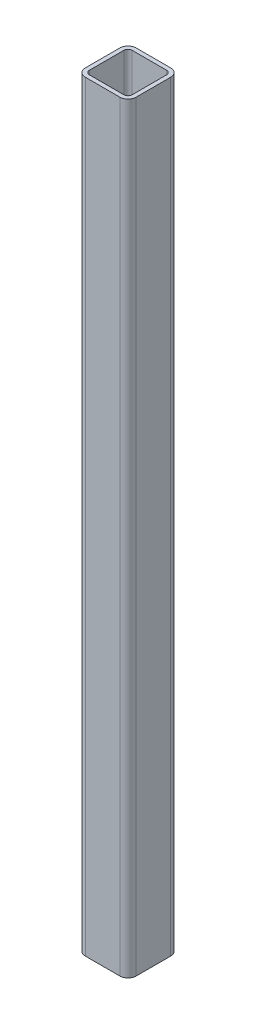
ISO-10303-21;
HEADER;
FILE_DESCRIPTION(('STEP AP214'),'2;1');
FILE_NAME('part.step','',(''),(''),'','','');
FILE_SCHEMA(('AUTOMOTIVE_DESIGN { 1 0 10303 214 1 1 1 1 }'));
ENDSEC;
DATA;
#1=APPLICATION_CONTEXT('core data for automotive mechanical design processes');
#2=APPLICATION_PROTOCOL_DEFINITION('international standard','automotive_design',2000,#1);
#3=PRODUCT_CONTEXT('',#1,'mechanical');
#4=PRODUCT('Part','Part','',(#3));
#5=PRODUCT_RELATED_PRODUCT_CATEGORY('part','',(#4));
#6=PRODUCT_DEFINITION_FORMATION('','',#4);
#7=PRODUCT_DEFINITION_CONTEXT('part definition',#1,'design');
#8=PRODUCT_DEFINITION('design','',#6,#7);
#9=PRODUCT_DEFINITION_SHAPE('','',#8);
#10=(LENGTH_UNIT() NAMED_UNIT(*) SI_UNIT(.MILLI.,.METRE.));
#11=(NAMED_UNIT(*) PLANE_ANGLE_UNIT() SI_UNIT($,.RADIAN.));
#12=(NAMED_UNIT(*) SI_UNIT($,.STERADIAN.) SOLID_ANGLE_UNIT());
#13=UNCERTAINTY_MEASURE_WITH_UNIT(LENGTH_MEASURE(1.E-05),#10,'distance_accuracy_value','');
#14=(GEOMETRIC_REPRESENTATION_CONTEXT(3) GLOBAL_UNCERTAINTY_ASSIGNED_CONTEXT((#13)) GLOBAL_UNIT_ASSIGNED_CONTEXT((#10,
#11,#12)) REPRESENTATION_CONTEXT('',''));
#15=CARTESIAN_POINT('',(0.,0.,0.));
#16=DIRECTION('',(0.,0.,1.));
#17=DIRECTION('',(1.,0.,0.));
#18=AXIS2_PLACEMENT_3D('',#15,#16,#17);
#19=CARTESIAN_POINT('',(1193.6,910.,293.6));
#20=DIRECTION('',(0.,1.,0.));
#21=DIRECTION('',(0.,0.,1.));
#22=AXIS2_PLACEMENT_3D('',#19,#20,#21);
#23=CYLINDRICAL_SURFACE('',#22,6.39999999999996);
#24=CARTESIAN_POINT('',(1193.6,930.,293.6));
#25=DIRECTION('',(0.,1.,0.));
#26=DIRECTION('',(0.,0.,1.));
#27=AXIS2_PLACEMENT_3D('',#24,#25,#26);
#28=CIRCLE('',#27,6.39999999999996);
#29=CARTESIAN_POINT('',(1200.,930.,293.6));
#30=VERTEX_POINT('',#29);
#31=CARTESIAN_POINT('',(1193.6,930.,300.));
#32=VERTEX_POINT('',#31);
#33=EDGE_CURVE('E151',#30,#32,#28,.F.);
#34=ORIENTED_EDGE('',*,*,#33,.F.);
#35=DIRECTION('',(0.,1.,0.));
#36=VECTOR('',#35,1.);
#37=CARTESIAN_POINT('',(1200.,910.,293.6));
#38=LINE('',#37,#36);
#39=CARTESIAN_POINT('',(1200.,1530.,293.6));
#40=VERTEX_POINT('',#39);
#41=EDGE_CURVE('E139',#30,#40,#38,.T.);
#42=ORIENTED_EDGE('',*,*,#41,.T.);
#43=CARTESIAN_POINT('',(1193.6,1530.,293.6));
#44=DIRECTION('',(0.,1.,0.));
#45=DIRECTION('',(0.,0.,1.));
#46=AXIS2_PLACEMENT_3D('',#43,#44,#45);
#47=CIRCLE('',#46,6.39999999999996);
#48=CARTESIAN_POINT('',(1193.6,1530.,300.));
#49=VERTEX_POINT('',#48);
#50=EDGE_CURVE('E190',#49,#40,#47,.T.);
#51=ORIENTED_EDGE('',*,*,#50,.F.);
#52=DIRECTION('',(0.,1.,0.));
#53=VECTOR('',#52,1.);
#54=CARTESIAN_POINT('',(1193.6,910.,300.));
#55=LINE('',#54,#53);
#56=EDGE_CURVE('E157',#49,#32,#55,.F.);
#57=ORIENTED_EDGE('',*,*,#56,.T.);
#58=EDGE_LOOP('',(#34,#42,#51,#57));
#59=FACE_BOUND('',#58,.T.);
#60=ADVANCED_FACE('F19',(#59),#23,.T.);
#61=CARTESIAN_POINT('',(1200.,910.,293.599999999999));
#62=DIRECTION('',(-1.,0.,0.));
#63=DIRECTION('',(0.,0.,1.));
#64=AXIS2_PLACEMENT_3D('',#61,#62,#63);
#65=PLANE('',#64);
#66=DIRECTION('',(0.,0.,1.));
#67=VECTOR('',#66,1.);
#68=CARTESIAN_POINT('',(1200.,1530.,-880.000000000001));
#69=LINE('',#68,#67);
#70=CARTESIAN_POINT('',(1200.,1530.,266.4));
#71=VERTEX_POINT('',#70);
#72=EDGE_CURVE('E192',#40,#71,#69,.F.);
#73=ORIENTED_EDGE('',*,*,#72,.F.);
#74=ORIENTED_EDGE('',*,*,#41,.F.);
#75=DIRECTION('',(0.,0.,-1.));
#76=VECTOR('',#75,1.);
#77=CARTESIAN_POINT('',(1200.,930.,-880.));
#78=LINE('',#77,#76);
#79=CARTESIAN_POINT('',(1200.,930.,266.4));
#80=VERTEX_POINT('',#79);
#81=EDGE_CURVE('E145',#80,#30,#78,.F.);
#82=ORIENTED_EDGE('',*,*,#81,.F.);
#83=DIRECTION('',(0.,1.,0.));
#84=VECTOR('',#83,1.);
#85=CARTESIAN_POINT('',(1200.,910.,266.4));
#86=LINE('',#85,#84);
#87=EDGE_CURVE('E132',#71,#80,#86,.F.);
#88=ORIENTED_EDGE('',*,*,#87,.F.);
#89=EDGE_LOOP('',(#73,#74,#82,#88));
#90=FACE_BOUND('',#89,.T.);
#91=ADVANCED_FACE('F149',(#90),#65,.F.);
#92=CARTESIAN_POINT('',(1193.6,910.,266.399999999999));
#93=DIRECTION('',(0.,1.,0.));
#94=DIRECTION('',(0.,0.,1.));
#95=AXIS2_PLACEMENT_3D('',#92,#93,#94);
#96=CYLINDRICAL_SURFACE('',#95,6.39999999999996);
#97=CARTESIAN_POINT('',(1193.6,930.,266.399999999999));
#98=DIRECTION('',(0.,1.,0.));
#99=DIRECTION('',(0.,0.,1.));
#100=AXIS2_PLACEMENT_3D('',#97,#98,#99);
#101=CIRCLE('',#100,6.39999999999996);
#102=CARTESIAN_POINT('',(1193.6,930.,260.));
#103=VERTEX_POINT('',#102);
#104=EDGE_CURVE('E22',#103,#80,#101,.F.);
#105=ORIENTED_EDGE('',*,*,#104,.F.);
#106=DIRECTION('',(0.,-1.,0.));
#107=VECTOR('',#106,1.);
#108=CARTESIAN_POINT('',(1193.6,910.,259.999999999999));
#109=LINE('',#108,#107);
#110=CARTESIAN_POINT('',(1193.6,1530.,260.));
#111=VERTEX_POINT('',#110);
#112=EDGE_CURVE('E125',#103,#111,#109,.F.);
#113=ORIENTED_EDGE('',*,*,#112,.T.);
#114=CARTESIAN_POINT('',(1193.6,1530.,266.4));
#115=DIRECTION('',(0.,1.,0.));
#116=DIRECTION('',(0.,0.,1.));
#117=AXIS2_PLACEMENT_3D('',#114,#115,#116);
#118=CIRCLE('',#117,6.39999999999996);
#119=EDGE_CURVE('E135',#71,#111,#118,.T.);
#120=ORIENTED_EDGE('',*,*,#119,.F.);
#121=ORIENTED_EDGE('',*,*,#87,.T.);
#122=EDGE_LOOP('',(#105,#113,#120,#121));
#123=FACE_BOUND('',#122,.T.);
#124=ADVANCED_FACE('F134',(#123),#96,.T.);
#125=CARTESIAN_POINT('',(1166.4,910.,259.999999999999));
#126=DIRECTION('',(0.,0.,1.));
#127=DIRECTION('',(0.,-1.,0.));
#128=AXIS2_PLACEMENT_3D('',#125,#126,#127);
#129=PLANE('',#128);
#130=DIRECTION('',(1.,0.,0.));
#131=VECTOR('',#130,1.);
#132=CARTESIAN_POINT('',(1193.6,1530.,260.));
#133=LINE('',#132,#131);
#134=CARTESIAN_POINT('',(1166.4,1530.,260.));
#135=VERTEX_POINT('',#134);
#136=EDGE_CURVE('E224',#111,#135,#133,.F.);
#137=ORIENTED_EDGE('',*,*,#136,.F.);
#138=ORIENTED_EDGE('',*,*,#112,.F.);
#139=DIRECTION('',(1.,0.,0.));
#140=VECTOR('',#139,1.);
#141=CARTESIAN_POINT('',(1166.4,930.,260.));
#142=LINE('',#141,#140);
#143=CARTESIAN_POINT('',(1166.4,930.,260.));
#144=VERTEX_POINT('',#143);
#145=EDGE_CURVE('E148',#144,#103,#142,.T.);
#146=ORIENTED_EDGE('',*,*,#145,.F.);
#147=DIRECTION('',(0.,1.,0.));
#148=VECTOR('',#147,1.);
#149=CARTESIAN_POINT('',(1166.4,910.,259.999999999999));
#150=LINE('',#149,#148);
#151=EDGE_CURVE('E227',#135,#144,#150,.F.);
#152=ORIENTED_EDGE('',*,*,#151,.F.);
#153=EDGE_LOOP('',(#137,#138,#146,#152));
#154=FACE_BOUND('',#153,.T.);
#155=ADVANCED_FACE('F265',(#154),#129,.F.);
#156=CARTESIAN_POINT('',(1193.6,910.,296.8));
#157=DIRECTION('',(0.,0.,-1.));
#158=DIRECTION('',(0.,1.,0.));
#159=AXIS2_PLACEMENT_3D('',#156,#157,#158);
#160=PLANE('',#159);
#161=DIRECTION('',(0.,1.,0.));
#162=VECTOR('',#161,1.);
#163=CARTESIAN_POINT('',(1193.6,910.,296.799999999999));
#164=LINE('',#163,#162);
#165=CARTESIAN_POINT('',(1193.6,1530.,296.799999999999));
#166=VERTEX_POINT('',#165);
#167=CARTESIAN_POINT('',(1193.6,930.,296.799999999999));
#168=VERTEX_POINT('',#167);
#169=EDGE_CURVE('E166',#166,#168,#164,.F.);
#170=ORIENTED_EDGE('',*,*,#169,.T.);
#171=DIRECTION('',(1.,0.,0.));
#172=VECTOR('',#171,1.);
#173=CARTESIAN_POINT('',(1166.4,930.,296.799999999999));
#174=LINE('',#173,#172);
#175=CARTESIAN_POINT('',(1166.4,930.,296.799999999999));
#176=VERTEX_POINT('',#175);
#177=EDGE_CURVE('E237',#176,#168,#174,.T.);
#178=ORIENTED_EDGE('',*,*,#177,.F.);
#179=DIRECTION('',(0.,1.,0.));
#180=VECTOR('',#179,1.);
#181=CARTESIAN_POINT('',(1166.4,910.,296.799999999999));
#182=LINE('',#181,#180);
#183=CARTESIAN_POINT('',(1166.4,1530.,296.799999999999));
#184=VERTEX_POINT('',#183);
#185=EDGE_CURVE('E264',#176,#184,#182,.T.);
#186=ORIENTED_EDGE('',*,*,#185,.T.);
#187=DIRECTION('',(1.,0.,0.));
#188=VECTOR('',#187,1.);
#189=CARTESIAN_POINT('',(1193.6,1530.,296.799999999999));
#190=LINE('',#189,#188);
#191=EDGE_CURVE('E221',#166,#184,#190,.F.);
#192=ORIENTED_EDGE('',*,*,#191,.F.);
#193=EDGE_LOOP('',(#170,#178,#186,#192));
#194=FACE_BOUND('',#193,.T.);
#195=ADVANCED_FACE('F286',(#194),#160,.T.);
#196=CARTESIAN_POINT('',(1166.4,910.,293.599999999999));
#197=DIRECTION('',(0.,1.,0.));
#198=DIRECTION('',(0.,0.,1.));
#199=AXIS2_PLACEMENT_3D('',#196,#197,#198);
#200=CYLINDRICAL_SURFACE('',#199,3.19999999999998);
#201=DIRECTION('',(0.,1.,0.));
#202=VECTOR('',#201,1.);
#203=CARTESIAN_POINT('',(1163.2,910.,293.6));
#204=LINE('',#203,#202);
#205=CARTESIAN_POINT('',(1163.2,1530.,293.6));
#206=VERTEX_POINT('',#205);
#207=CARTESIAN_POINT('',(1163.2,930.,293.6));
#208=VERTEX_POINT('',#207);
#209=EDGE_CURVE('E294',#206,#208,#204,.F.);
#210=ORIENTED_EDGE('',*,*,#209,.F.);
#211=CARTESIAN_POINT('',(1166.4,1530.,293.6));
#212=DIRECTION('',(0.,1.,0.));
#213=DIRECTION('',(0.,0.,1.));
#214=AXIS2_PLACEMENT_3D('',#211,#212,#213);
#215=CIRCLE('',#214,3.19999999999998);
#216=EDGE_CURVE('E219',#184,#206,#215,.F.);
#217=ORIENTED_EDGE('',*,*,#216,.F.);
#218=ORIENTED_EDGE('',*,*,#185,.F.);
#219=CARTESIAN_POINT('',(1166.4,930.,293.599999999999));
#220=DIRECTION('',(0.,1.,0.));
#221=DIRECTION('',(0.,0.,1.));
#222=AXIS2_PLACEMENT_3D('',#219,#220,#221);
#223=CIRCLE('',#222,3.19999999999998);
#224=EDGE_CURVE('E238',#208,#176,#223,.T.);
#225=ORIENTED_EDGE('',*,*,#224,.F.);
#226=EDGE_LOOP('',(#210,#217,#218,#225));
#227=FACE_BOUND('',#226,.T.);
#228=ADVANCED_FACE('F295',(#227),#200,.F.);
#229=CARTESIAN_POINT('',(1163.2,910.,266.399999999999));
#230=DIRECTION('',(1.,0.,0.));
#231=DIRECTION('',(0.,0.,-1.));
#232=AXIS2_PLACEMENT_3D('',#229,#230,#231);
#233=PLANE('',#232);
#234=ORIENTED_EDGE('',*,*,#209,.T.);
#235=DIRECTION('',(0.,0.,-1.));
#236=VECTOR('',#235,1.);
#237=CARTESIAN_POINT('',(1163.2,930.,-880.));
#238=LINE('',#237,#236);
#239=CARTESIAN_POINT('',(1163.2,930.,266.4));
#240=VERTEX_POINT('',#239);
#241=EDGE_CURVE('E241',#240,#208,#238,.F.);
#242=ORIENTED_EDGE('',*,*,#241,.F.);
#243=DIRECTION('',(0.,1.,0.));
#244=VECTOR('',#243,1.);
#245=CARTESIAN_POINT('',(1163.2,910.,266.4));
#246=LINE('',#245,#244);
#247=CARTESIAN_POINT('',(1163.2,1530.,266.4));
#248=VERTEX_POINT('',#247);
#249=EDGE_CURVE('E177',#240,#248,#246,.T.);
#250=ORIENTED_EDGE('',*,*,#249,.T.);
#251=DIRECTION('',(0.,0.,1.));
#252=VECTOR('',#251,1.);
#253=CARTESIAN_POINT('',(1163.2,1530.,-880.000000000001));
#254=LINE('',#253,#252);
#255=EDGE_CURVE('E218',#206,#248,#254,.F.);
#256=ORIENTED_EDGE('',*,*,#255,.F.);
#257=EDGE_LOOP('',(#234,#242,#250,#256));
#258=FACE_BOUND('',#257,.T.);
#259=ADVANCED_FACE('F297',(#258),#233,.T.);
#260=CARTESIAN_POINT('',(1166.4,910.,266.399999999999));
#261=DIRECTION('',(0.,1.,0.));
#262=DIRECTION('',(0.,0.,1.));
#263=AXIS2_PLACEMENT_3D('',#260,#261,#262);
#264=CYLINDRICAL_SURFACE('',#263,3.19999999999993);
#265=DIRECTION('',(0.,-1.,0.));
#266=VECTOR('',#265,1.);
#267=CARTESIAN_POINT('',(1166.4,910.,263.199999999999));
#268=LINE('',#267,#266);
#269=CARTESIAN_POINT('',(1166.4,1530.,263.2));
#270=VERTEX_POINT('',#269);
#271=CARTESIAN_POINT('',(1166.4,930.,263.2));
#272=VERTEX_POINT('',#271);
#273=EDGE_CURVE('E174',#270,#272,#268,.T.);
#274=ORIENTED_EDGE('',*,*,#273,.F.);
#275=CARTESIAN_POINT('',(1166.4,1530.,266.4));
#276=DIRECTION('',(0.,1.,0.));
#277=DIRECTION('',(0.,0.,1.));
#278=AXIS2_PLACEMENT_3D('',#275,#276,#277);
#279=CIRCLE('',#278,3.19999999999993);
#280=EDGE_CURVE('E216',#248,#270,#279,.F.);
#281=ORIENTED_EDGE('',*,*,#280,.F.);
#282=ORIENTED_EDGE('',*,*,#249,.F.);
#283=CARTESIAN_POINT('',(1166.4,930.,266.399999999999));
#284=DIRECTION('',(0.,1.,0.));
#285=DIRECTION('',(0.,0.,1.));
#286=AXIS2_PLACEMENT_3D('',#283,#284,#285);
#287=CIRCLE('',#286,3.19999999999993);
#288=EDGE_CURVE('E242',#272,#240,#287,.T.);
#289=ORIENTED_EDGE('',*,*,#288,.F.);
#290=EDGE_LOOP('',(#274,#281,#282,#289));
#291=FACE_BOUND('',#290,.T.);
#292=ADVANCED_FACE('F301',(#291),#264,.F.);
#293=CARTESIAN_POINT('',(1166.4,910.,263.199999999999));
#294=DIRECTION('',(0.,0.,1.));
#295=DIRECTION('',(0.,-1.,0.));
#296=AXIS2_PLACEMENT_3D('',#293,#294,#295);
#297=PLANE('',#296);
#298=ORIENTED_EDGE('',*,*,#273,.T.);
#299=DIRECTION('',(1.,0.,0.));
#300=VECTOR('',#299,1.);
#301=CARTESIAN_POINT('',(1166.4,930.,263.2));
#302=LINE('',#301,#300);
#303=CARTESIAN_POINT('',(1193.6,930.,263.2));
#304=VERTEX_POINT('',#303);
#305=EDGE_CURVE('E232',#304,#272,#302,.F.);
#306=ORIENTED_EDGE('',*,*,#305,.F.);
#307=DIRECTION('',(0.,1.,0.));
#308=VECTOR('',#307,1.);
#309=CARTESIAN_POINT('',(1193.6,910.,263.2));
#310=LINE('',#309,#308);
#311=CARTESIAN_POINT('',(1193.6,1530.,263.2));
#312=VERTEX_POINT('',#311);
#313=EDGE_CURVE('E171',#304,#312,#310,.T.);
#314=ORIENTED_EDGE('',*,*,#313,.T.);
#315=DIRECTION('',(1.,0.,0.));
#316=VECTOR('',#315,1.);
#317=CARTESIAN_POINT('',(1193.6,1530.,263.2));
#318=LINE('',#317,#316);
#319=EDGE_CURVE('E215',#270,#312,#318,.T.);
#320=ORIENTED_EDGE('',*,*,#319,.F.);
#321=EDGE_LOOP('',(#298,#306,#314,#320));
#322=FACE_BOUND('',#321,.T.);
#323=ADVANCED_FACE('F305',(#322),#297,.T.);
#324=CARTESIAN_POINT('',(1193.6,910.,266.399999999999));
#325=DIRECTION('',(0.,1.,0.));
#326=DIRECTION('',(0.,0.,1.));
#327=AXIS2_PLACEMENT_3D('',#324,#325,#326);
#328=CYLINDRICAL_SURFACE('',#327,3.19999999999993);
#329=DIRECTION('',(0.,1.,0.));
#330=VECTOR('',#329,1.);
#331=CARTESIAN_POINT('',(1196.8,910.,266.4));
#332=LINE('',#331,#330);
#333=CARTESIAN_POINT('',(1196.8,1530.,266.4));
#334=VERTEX_POINT('',#333);
#335=CARTESIAN_POINT('',(1196.8,930.,266.4));
#336=VERTEX_POINT('',#335);
#337=EDGE_CURVE('E167',#334,#336,#332,.F.);
#338=ORIENTED_EDGE('',*,*,#337,.F.);
#339=CARTESIAN_POINT('',(1193.6,1530.,266.4));
#340=DIRECTION('',(0.,1.,0.));
#341=DIRECTION('',(0.,0.,1.));
#342=AXIS2_PLACEMENT_3D('',#339,#340,#341);
#343=CIRCLE('',#342,3.19999999999993);
#344=EDGE_CURVE('E213',#312,#334,#343,.F.);
#345=ORIENTED_EDGE('',*,*,#344,.F.);
#346=ORIENTED_EDGE('',*,*,#313,.F.);
#347=CARTESIAN_POINT('',(1193.6,930.,266.399999999999));
#348=DIRECTION('',(0.,1.,0.));
#349=DIRECTION('',(0.,0.,1.));
#350=AXIS2_PLACEMENT_3D('',#347,#348,#349);
#351=CIRCLE('',#350,3.19999999999993);
#352=EDGE_CURVE('E228',#336,#304,#351,.T.);
#353=ORIENTED_EDGE('',*,*,#352,.F.);
#354=EDGE_LOOP('',(#338,#345,#346,#353));
#355=FACE_BOUND('',#354,.T.);
#356=ADVANCED_FACE('F308',(#355),#328,.F.);
#357=CARTESIAN_POINT('',(1196.8,910.,293.6));
#358=DIRECTION('',(-1.,0.,0.));
#359=DIRECTION('',(0.,0.,1.));
#360=AXIS2_PLACEMENT_3D('',#357,#358,#359);
#361=PLANE('',#360);
#362=ORIENTED_EDGE('',*,*,#337,.T.);
#363=DIRECTION('',(0.,0.,-1.));
#364=VECTOR('',#363,1.);
#365=CARTESIAN_POINT('',(1196.8,930.,-880.));
#366=LINE('',#365,#364);
#367=CARTESIAN_POINT('',(1196.8,930.,293.6));
#368=VERTEX_POINT('',#367);
#369=EDGE_CURVE('E233',#368,#336,#366,.T.);
#370=ORIENTED_EDGE('',*,*,#369,.F.);
#371=DIRECTION('',(0.,1.,0.));
#372=VECTOR('',#371,1.);
#373=CARTESIAN_POINT('',(1196.8,910.,293.6));
#374=LINE('',#373,#372);
#375=CARTESIAN_POINT('',(1196.8,1530.,293.6));
#376=VERTEX_POINT('',#375);
#377=EDGE_CURVE('E163',#368,#376,#374,.T.);
#378=ORIENTED_EDGE('',*,*,#377,.T.);
#379=DIRECTION('',(0.,0.,1.));
#380=VECTOR('',#379,1.);
#381=CARTESIAN_POINT('',(1196.8,1530.,-880.000000000001));
#382=LINE('',#381,#380);
#383=EDGE_CURVE('E212',#334,#376,#382,.T.);
#384=ORIENTED_EDGE('',*,*,#383,.F.);
#385=EDGE_LOOP('',(#362,#370,#378,#384));
#386=FACE_BOUND('',#385,.T.);
#387=ADVANCED_FACE('F279',(#386),#361,.T.);
#388=CARTESIAN_POINT('',(1193.6,910.,293.6));
#389=DIRECTION('',(0.,1.,0.));
#390=DIRECTION('',(0.,0.,1.));
#391=AXIS2_PLACEMENT_3D('',#388,#389,#390);
#392=CYLINDRICAL_SURFACE('',#391,3.19999999999993);
#393=ORIENTED_EDGE('',*,*,#169,.F.);
#394=CARTESIAN_POINT('',(1193.6,1530.,293.6));
#395=DIRECTION('',(0.,1.,0.));
#396=DIRECTION('',(0.,0.,1.));
#397=AXIS2_PLACEMENT_3D('',#394,#395,#396);
#398=CIRCLE('',#397,3.19999999999993);
#399=EDGE_CURVE('E209',#376,#166,#398,.F.);
#400=ORIENTED_EDGE('',*,*,#399,.F.);
#401=ORIENTED_EDGE('',*,*,#377,.F.);
#402=CARTESIAN_POINT('',(1193.6,930.,293.6));
#403=DIRECTION('',(0.,1.,0.));
#404=DIRECTION('',(0.,0.,1.));
#405=AXIS2_PLACEMENT_3D('',#402,#403,#404);
#406=CIRCLE('',#405,3.19999999999993);
#407=EDGE_CURVE('E234',#168,#368,#406,.T.);
#408=ORIENTED_EDGE('',*,*,#407,.F.);
#409=EDGE_LOOP('',(#393,#400,#401,#408));
#410=FACE_BOUND('',#409,.T.);
#411=ADVANCED_FACE('F283',(#410),#392,.F.);
#412=CARTESIAN_POINT('',(1193.6,910.,300.));
#413=DIRECTION('',(0.,0.,-1.));
#414=DIRECTION('',(0.,1.,0.));
#415=AXIS2_PLACEMENT_3D('',#412,#413,#414);
#416=PLANE('',#415);
#417=DIRECTION('',(1.,0.,0.));
#418=VECTOR('',#417,1.);
#419=CARTESIAN_POINT('',(1193.6,1530.,300.));
#420=LINE('',#419,#418);
#421=CARTESIAN_POINT('',(1166.4,1530.,300.));
#422=VERTEX_POINT('',#421);
#423=EDGE_CURVE('E185',#422,#49,#420,.T.);
#424=ORIENTED_EDGE('',*,*,#423,.F.);
#425=DIRECTION('',(0.,1.,0.));
#426=VECTOR('',#425,1.);
#427=CARTESIAN_POINT('',(1166.4,910.,299.999999999999));
#428=LINE('',#427,#426);
#429=CARTESIAN_POINT('',(1166.4,930.,300.));
#430=VERTEX_POINT('',#429);
#431=EDGE_CURVE('E158',#430,#422,#428,.T.);
#432=ORIENTED_EDGE('',*,*,#431,.F.);
#433=DIRECTION('',(1.,0.,0.));
#434=VECTOR('',#433,1.);
#435=CARTESIAN_POINT('',(1166.4,930.,300.));
#436=LINE('',#435,#434);
#437=EDGE_CURVE('E153',#32,#430,#436,.F.);
#438=ORIENTED_EDGE('',*,*,#437,.F.);
#439=ORIENTED_EDGE('',*,*,#56,.F.);
#440=EDGE_LOOP('',(#424,#432,#438,#439));
#441=FACE_BOUND('',#440,.T.);
#442=ADVANCED_FACE('F257',(#441),#416,.F.);
#443=CARTESIAN_POINT('',(1166.4,930.,-880.));
#444=DIRECTION('',(0.,-1.,0.));
#445=DIRECTION('',(0.,0.,-1.));
#446=AXIS2_PLACEMENT_3D('',#443,#444,#445);
#447=PLANE('',#446);
#448=ORIENTED_EDGE('',*,*,#352,.T.);
#449=ORIENTED_EDGE('',*,*,#305,.T.);
#450=ORIENTED_EDGE('',*,*,#288,.T.);
#451=ORIENTED_EDGE('',*,*,#241,.T.);
#452=ORIENTED_EDGE('',*,*,#224,.T.);
#453=ORIENTED_EDGE('',*,*,#177,.T.);
#454=ORIENTED_EDGE('',*,*,#407,.T.);
#455=ORIENTED_EDGE('',*,*,#369,.T.);
#456=EDGE_LOOP('',(#448,#449,#450,#451,#452,#453,#454,#455));
#457=FACE_BOUND('',#456,.T.);
#458=CARTESIAN_POINT('',(1166.4,930.,293.599999999999));
#459=DIRECTION('',(0.,1.,0.));
#460=DIRECTION('',(0.,0.,1.));
#461=AXIS2_PLACEMENT_3D('',#458,#459,#460);
#462=CIRCLE('',#461,6.40000000000002);
#463=CARTESIAN_POINT('',(1160.,930.,293.6));
#464=VERTEX_POINT('',#463);
#465=EDGE_CURVE('E162',#464,#430,#462,.T.);
#466=ORIENTED_EDGE('',*,*,#465,.F.);
#467=DIRECTION('',(0.,0.,-1.));
#468=VECTOR('',#467,1.);
#469=CARTESIAN_POINT('',(1160.,930.,266.399999999999));
#470=LINE('',#469,#468);
#471=CARTESIAN_POINT('',(1160.,930.,266.399999999999));
#472=VERTEX_POINT('',#471);
#473=EDGE_CURVE('E161',#464,#472,#470,.T.);
#474=ORIENTED_EDGE('',*,*,#473,.T.);
#475=CARTESIAN_POINT('',(1166.4,930.,266.399999999999));
#476=DIRECTION('',(0.,1.,0.));
#477=DIRECTION('',(0.,0.,1.));
#478=AXIS2_PLACEMENT_3D('',#475,#476,#477);
#479=CIRCLE('',#478,6.39999999999996);
#480=EDGE_CURVE('E191',#144,#472,#479,.T.);
#481=ORIENTED_EDGE('',*,*,#480,.F.);
#482=ORIENTED_EDGE('',*,*,#145,.T.);
#483=ORIENTED_EDGE('',*,*,#104,.T.);
#484=ORIENTED_EDGE('',*,*,#81,.T.);
#485=ORIENTED_EDGE('',*,*,#33,.T.);
#486=ORIENTED_EDGE('',*,*,#437,.T.);
#487=EDGE_LOOP('',(#466,#474,#481,#482,#483,#484,#485,#486));
#488=FACE_BOUND('',#487,.T.);
#489=ADVANCED_FACE('F144',(#457,#488),#447,.T.);
#490=CARTESIAN_POINT('',(1166.4,910.,266.399999999999));
#491=DIRECTION('',(0.,1.,0.));
#492=DIRECTION('',(0.,0.,1.));
#493=AXIS2_PLACEMENT_3D('',#490,#491,#492);
#494=CYLINDRICAL_SURFACE('',#493,6.39999999999996);
#495=ORIENTED_EDGE('',*,*,#480,.T.);
#496=DIRECTION('',(0.,1.,0.));
#497=VECTOR('',#496,1.);
#498=CARTESIAN_POINT('',(1160.,910.,266.399999999999));
#499=LINE('',#498,#497);
#500=CARTESIAN_POINT('',(1160.,1530.,266.399999999999));
#501=VERTEX_POINT('',#500);
#502=EDGE_CURVE('E194',#472,#501,#499,.T.);
#503=ORIENTED_EDGE('',*,*,#502,.T.);
#504=CARTESIAN_POINT('',(1166.4,1530.,266.4));
#505=DIRECTION('',(0.,1.,0.));
#506=DIRECTION('',(0.,0.,1.));
#507=AXIS2_PLACEMENT_3D('',#504,#505,#506);
#508=CIRCLE('',#507,6.39999999999996);
#509=EDGE_CURVE('E222',#135,#501,#508,.T.);
#510=ORIENTED_EDGE('',*,*,#509,.F.);
#511=ORIENTED_EDGE('',*,*,#151,.T.);
#512=EDGE_LOOP('',(#495,#503,#510,#511));
#513=FACE_BOUND('',#512,.T.);
#514=ADVANCED_FACE('F320',(#513),#494,.T.);
#515=CARTESIAN_POINT('',(1193.6,1530.,-880.000000000001));
#516=DIRECTION('',(0.,1.,0.));
#517=DIRECTION('',(0.,0.,1.));
#518=AXIS2_PLACEMENT_3D('',#515,#516,#517);
#519=PLANE('',#518);
#520=ORIENTED_EDGE('',*,*,#383,.T.);
#521=ORIENTED_EDGE('',*,*,#399,.T.);
#522=ORIENTED_EDGE('',*,*,#191,.T.);
#523=ORIENTED_EDGE('',*,*,#216,.T.);
#524=ORIENTED_EDGE('',*,*,#255,.T.);
#525=ORIENTED_EDGE('',*,*,#280,.T.);
#526=ORIENTED_EDGE('',*,*,#319,.T.);
#527=ORIENTED_EDGE('',*,*,#344,.T.);
#528=EDGE_LOOP('',(#520,#521,#522,#523,#524,#525,#526,#527));
#529=FACE_BOUND('',#528,.T.);
#530=ORIENTED_EDGE('',*,*,#509,.T.);
#531=DIRECTION('',(0.,0.,-1.));
#532=VECTOR('',#531,1.);
#533=CARTESIAN_POINT('',(1160.,1530.,266.399999999999));
#534=LINE('',#533,#532);
#535=CARTESIAN_POINT('',(1160.,1530.,293.6));
#536=VERTEX_POINT('',#535);
#537=EDGE_CURVE('E28',#501,#536,#534,.F.);
#538=ORIENTED_EDGE('',*,*,#537,.T.);
#539=CARTESIAN_POINT('',(1166.4,1530.,293.6));
#540=DIRECTION('',(0.,1.,0.));
#541=DIRECTION('',(0.,0.,1.));
#542=AXIS2_PLACEMENT_3D('',#539,#540,#541);
#543=CIRCLE('',#542,6.40000000000002);
#544=EDGE_CURVE('E36',#422,#536,#543,.F.);
#545=ORIENTED_EDGE('',*,*,#544,.F.);
#546=ORIENTED_EDGE('',*,*,#423,.T.);
#547=ORIENTED_EDGE('',*,*,#50,.T.);
#548=ORIENTED_EDGE('',*,*,#72,.T.);
#549=ORIENTED_EDGE('',*,*,#119,.T.);
#550=ORIENTED_EDGE('',*,*,#136,.T.);
#551=EDGE_LOOP('',(#530,#538,#545,#546,#547,#548,#549,#550));
#552=FACE_BOUND('',#551,.T.);
#553=ADVANCED_FACE('F260',(#529,#552),#519,.T.);
#554=CARTESIAN_POINT('',(1166.4,910.,293.599999999999));
#555=DIRECTION('',(0.,1.,0.));
#556=DIRECTION('',(0.,0.,1.));
#557=AXIS2_PLACEMENT_3D('',#554,#555,#556);
#558=CYLINDRICAL_SURFACE('',#557,6.40000000000002);
#559=ORIENTED_EDGE('',*,*,#465,.T.);
#560=ORIENTED_EDGE('',*,*,#431,.T.);
#561=ORIENTED_EDGE('',*,*,#544,.T.);
#562=DIRECTION('',(0.,1.,0.));
#563=VECTOR('',#562,1.);
#564=CARTESIAN_POINT('',(1160.,910.,293.6));
#565=LINE('',#564,#563);
#566=EDGE_CURVE('E12',#536,#464,#565,.F.);
#567=ORIENTED_EDGE('',*,*,#566,.T.);
#568=EDGE_LOOP('',(#559,#560,#561,#567));
#569=FACE_BOUND('',#568,.T.);
#570=ADVANCED_FACE('F255',(#569),#558,.T.);
#571=CARTESIAN_POINT('',(1160.,910.,266.399999999999));
#572=DIRECTION('',(1.,0.,0.));
#573=DIRECTION('',(0.,0.,-1.));
#574=AXIS2_PLACEMENT_3D('',#571,#572,#573);
#575=PLANE('',#574);
#576=ORIENTED_EDGE('',*,*,#537,.F.);
#577=ORIENTED_EDGE('',*,*,#502,.F.);
#578=ORIENTED_EDGE('',*,*,#473,.F.);
#579=ORIENTED_EDGE('',*,*,#566,.F.);
#580=EDGE_LOOP('',(#576,#577,#578,#579));
#581=FACE_BOUND('',#580,.T.);
#582=ADVANCED_FACE('F317',(#581),#575,.F.);
#583=CLOSED_SHELL('',(#60,#91,#124,#155,#195,#228,#259,#292,#323,#356,#387,#411,#442,#489,#514,
#553,#570,#582));
#584=MANIFOLD_SOLID_BREP('B1',#583);
#585=ADVANCED_BREP_SHAPE_REPRESENTATION('',(#18,#584),#14);
#586=SHAPE_DEFINITION_REPRESENTATION(#9,#585);
ENDSEC;
END-ISO-10303-21;
